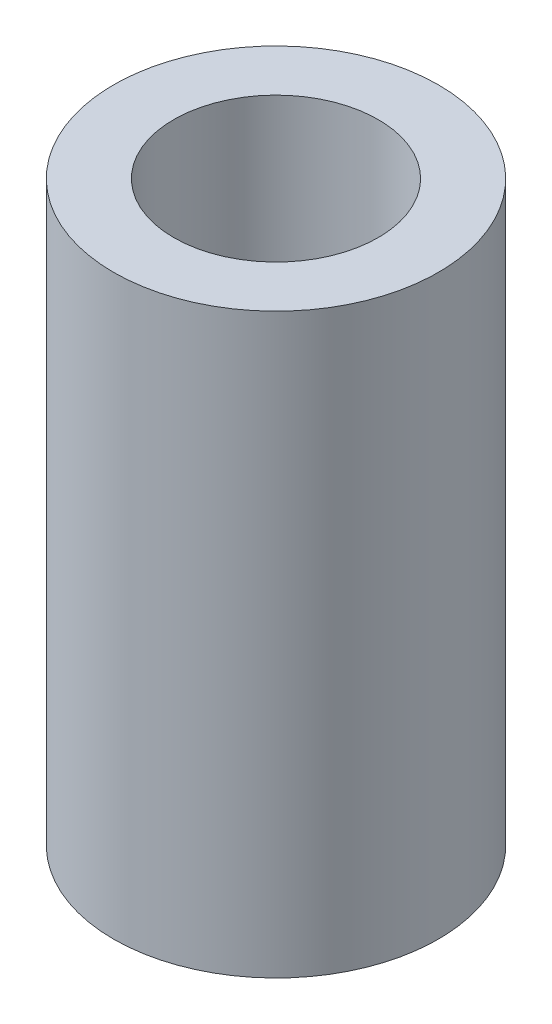
ISO-10303-21;
HEADER;
FILE_DESCRIPTION(('STEP AP214'),'2;1');
FILE_NAME('part.step','',(''),(''),'','','');
FILE_SCHEMA(('AUTOMOTIVE_DESIGN { 1 0 10303 214 1 1 1 1 }'));
ENDSEC;
DATA;
#1=APPLICATION_CONTEXT('core data for automotive mechanical design processes');
#2=APPLICATION_PROTOCOL_DEFINITION('international standard','automotive_design',2000,#1);
#3=PRODUCT_CONTEXT('',#1,'mechanical');
#4=PRODUCT('Part','Part','',(#3));
#5=PRODUCT_RELATED_PRODUCT_CATEGORY('part','',(#4));
#6=PRODUCT_DEFINITION_FORMATION('','',#4);
#7=PRODUCT_DEFINITION_CONTEXT('part definition',#1,'design');
#8=PRODUCT_DEFINITION('design','',#6,#7);
#9=PRODUCT_DEFINITION_SHAPE('','',#8);
#10=(LENGTH_UNIT() NAMED_UNIT(*) SI_UNIT(.MILLI.,.METRE.));
#11=(NAMED_UNIT(*) PLANE_ANGLE_UNIT() SI_UNIT($,.RADIAN.));
#12=(NAMED_UNIT(*) SI_UNIT($,.STERADIAN.) SOLID_ANGLE_UNIT());
#13=UNCERTAINTY_MEASURE_WITH_UNIT(LENGTH_MEASURE(1.E-05),#10,'distance_accuracy_value','');
#14=(GEOMETRIC_REPRESENTATION_CONTEXT(3) GLOBAL_UNCERTAINTY_ASSIGNED_CONTEXT((#13)) GLOBAL_UNIT_ASSIGNED_CONTEXT((#10,
#11,#12)) REPRESENTATION_CONTEXT('',''));
#15=CARTESIAN_POINT('',(0.,0.,0.));
#16=DIRECTION('',(0.,0.,1.));
#17=DIRECTION('',(1.,0.,0.));
#18=AXIS2_PLACEMENT_3D('',#15,#16,#17);
#19=CARTESIAN_POINT('',(0.,24.,0.));
#20=DIRECTION('',(0.,1.,0.));
#21=DIRECTION('',(0.,0.,1.));
#22=AXIS2_PLACEMENT_3D('',#19,#20,#21);
#23=PLANE('',#22);
#24=CARTESIAN_POINT('',(0.,24.,0.));
#25=DIRECTION('',(0.,1.,0.));
#26=DIRECTION('',(0.,0.,1.));
#27=AXIS2_PLACEMENT_3D('',#24,#25,#26);
#28=CIRCLE('',#27,6.75);
#29=CARTESIAN_POINT('',(0.,24.,6.75));
#30=VERTEX_POINT('',#29);
#31=EDGE_CURVE('E10',#30,#30,#28,.T.);
#32=ORIENTED_EDGE('',*,*,#31,.T.);
#33=EDGE_LOOP('',(#32));
#34=FACE_BOUND('',#33,.T.);
#35=CARTESIAN_POINT('',(0.,24.,0.));
#36=DIRECTION('',(0.,1.,0.));
#37=DIRECTION('',(0.,0.,1.));
#38=AXIS2_PLACEMENT_3D('',#35,#36,#37);
#39=CIRCLE('',#38,4.25);
#40=CARTESIAN_POINT('',(0.,24.,4.25));
#41=VERTEX_POINT('',#40);
#42=EDGE_CURVE('E42',#41,#41,#39,.T.);
#43=ORIENTED_EDGE('',*,*,#42,.F.);
#44=EDGE_LOOP('',(#43));
#45=FACE_BOUND('',#44,.T.);
#46=ADVANCED_FACE('F31',(#34,#45),#23,.T.);
#47=CARTESIAN_POINT('',(0.,0.,0.));
#48=DIRECTION('',(0.,1.,0.));
#49=DIRECTION('',(0.,0.,1.));
#50=AXIS2_PLACEMENT_3D('',#47,#48,#49);
#51=PLANE('',#50);
#52=CARTESIAN_POINT('',(0.,0.,0.));
#53=DIRECTION('',(0.,1.,0.));
#54=DIRECTION('',(0.,0.,1.));
#55=AXIS2_PLACEMENT_3D('',#52,#53,#54);
#56=CIRCLE('',#55,6.75);
#57=CARTESIAN_POINT('',(0.,0.,6.75));
#58=VERTEX_POINT('',#57);
#59=EDGE_CURVE('E35',#58,#58,#56,.T.);
#60=ORIENTED_EDGE('',*,*,#59,.F.);
#61=EDGE_LOOP('',(#60));
#62=FACE_BOUND('',#61,.T.);
#63=CARTESIAN_POINT('',(0.,0.,0.));
#64=DIRECTION('',(0.,1.,0.));
#65=DIRECTION('',(0.,0.,1.));
#66=AXIS2_PLACEMENT_3D('',#63,#64,#65);
#67=CIRCLE('',#66,4.25);
#68=CARTESIAN_POINT('',(0.,0.,4.25));
#69=VERTEX_POINT('',#68);
#70=EDGE_CURVE('E44',#69,#69,#67,.T.);
#71=ORIENTED_EDGE('',*,*,#70,.T.);
#72=EDGE_LOOP('',(#71));
#73=FACE_BOUND('',#72,.T.);
#74=ADVANCED_FACE('F54',(#62,#73),#51,.F.);
#75=CARTESIAN_POINT('',(0.,24.,0.));
#76=DIRECTION('',(0.,-1.,0.));
#77=DIRECTION('',(0.,0.,-1.));
#78=AXIS2_PLACEMENT_3D('',#75,#76,#77);
#79=CYLINDRICAL_SURFACE('',#78,6.75);
#80=ORIENTED_EDGE('',*,*,#31,.F.);
#81=EDGE_LOOP('',(#80));
#82=FACE_BOUND('',#81,.T.);
#83=ORIENTED_EDGE('',*,*,#59,.T.);
#84=EDGE_LOOP('',(#83));
#85=FACE_BOUND('',#84,.T.);
#86=ADVANCED_FACE('F33',(#82,#85),#79,.T.);
#87=CARTESIAN_POINT('',(0.,24.,0.));
#88=DIRECTION('',(0.,-1.,0.));
#89=DIRECTION('',(0.,0.,-1.));
#90=AXIS2_PLACEMENT_3D('',#87,#88,#89);
#91=CYLINDRICAL_SURFACE('',#90,4.25);
#92=ORIENTED_EDGE('',*,*,#42,.T.);
#93=EDGE_LOOP('',(#92));
#94=FACE_BOUND('',#93,.T.);
#95=ORIENTED_EDGE('',*,*,#70,.F.);
#96=EDGE_LOOP('',(#95));
#97=FACE_BOUND('',#96,.T.);
#98=ADVANCED_FACE('F50',(#94,#97),#91,.F.);
#99=CLOSED_SHELL('',(#46,#74,#86,#98));
#100=MANIFOLD_SOLID_BREP('B2',#99);
#101=ADVANCED_BREP_SHAPE_REPRESENTATION('',(#18,#100),#14);
#102=SHAPE_DEFINITION_REPRESENTATION(#9,#101);
ENDSEC;
END-ISO-10303-21;
